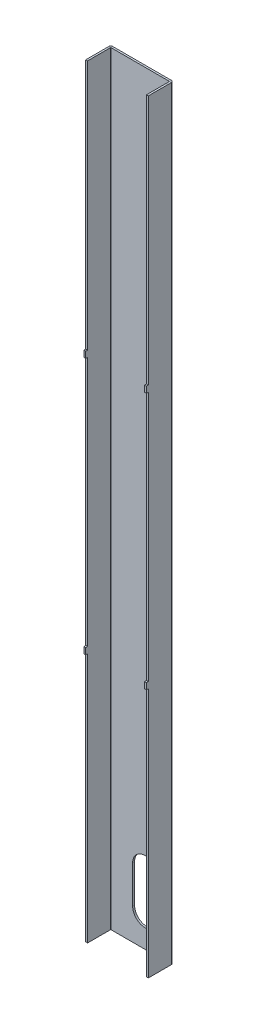
ISO-10303-21;
HEADER;
FILE_DESCRIPTION(('STEP AP214'),'2;1');
FILE_NAME('part.step','',(''),(''),'','','');
FILE_SCHEMA(('AUTOMOTIVE_DESIGN { 1 0 10303 214 1 1 1 1 }'));
ENDSEC;
DATA;
#1=APPLICATION_CONTEXT('core data for automotive mechanical design processes');
#2=APPLICATION_PROTOCOL_DEFINITION('international standard','automotive_design',2000,#1);
#3=PRODUCT_CONTEXT('',#1,'mechanical');
#4=PRODUCT('Part','Part','',(#3));
#5=PRODUCT_RELATED_PRODUCT_CATEGORY('part','',(#4));
#6=PRODUCT_DEFINITION_FORMATION('','',#4);
#7=PRODUCT_DEFINITION_CONTEXT('part definition',#1,'design');
#8=PRODUCT_DEFINITION('design','',#6,#7);
#9=PRODUCT_DEFINITION_SHAPE('','',#8);
#10=(LENGTH_UNIT() NAMED_UNIT(*) SI_UNIT(.MILLI.,.METRE.));
#11=(NAMED_UNIT(*) PLANE_ANGLE_UNIT() SI_UNIT($,.RADIAN.));
#12=(NAMED_UNIT(*) SI_UNIT($,.STERADIAN.) SOLID_ANGLE_UNIT());
#13=UNCERTAINTY_MEASURE_WITH_UNIT(LENGTH_MEASURE(1.E-05),#10,'distance_accuracy_value','');
#14=(GEOMETRIC_REPRESENTATION_CONTEXT(3) GLOBAL_UNCERTAINTY_ASSIGNED_CONTEXT((#13)) GLOBAL_UNIT_ASSIGNED_CONTEXT((#10,
#11,#12)) REPRESENTATION_CONTEXT('',''));
#15=CARTESIAN_POINT('',(0.,0.,0.));
#16=DIRECTION('',(0.,0.,1.));
#17=DIRECTION('',(1.,0.,0.));
#18=AXIS2_PLACEMENT_3D('',#15,#16,#17);
#19=CARTESIAN_POINT('',(1457.39849281617,-85.1666666666659,48.5000000000002));
#20=DIRECTION('',(0.,1.,0.));
#21=DIRECTION('',(1.,0.,0.));
#22=AXIS2_PLACEMENT_3D('',#19,#20,#21);
#23=PLANE('',#22);
#24=DIRECTION('',(0.,0.,-1.));
#25=VECTOR('',#24,1.);
#26=CARTESIAN_POINT('',(235.75,-85.1666666666659,48.5000000000002));
#27=LINE('',#26,#25);
#28=CARTESIAN_POINT('',(235.750000000001,-85.1666666666659,50.0000000000003));
#29=VERTEX_POINT('',#28);
#30=CARTESIAN_POINT('',(235.750000000001,-85.1666666666659,48.5000000000002));
#31=VERTEX_POINT('',#30);
#32=EDGE_CURVE('E161',#29,#31,#27,.T.);
#33=ORIENTED_EDGE('',*,*,#32,.F.);
#34=DIRECTION('',(-1.,0.,0.));
#35=VECTOR('',#34,1.);
#36=CARTESIAN_POINT('',(1457.39849281617,-85.1666666666659,50.0000000000003));
#37=LINE('',#36,#35);
#38=CARTESIAN_POINT('',(237.250000000001,-85.1666666666659,50.0000000000003));
#39=VERTEX_POINT('',#38);
#40=EDGE_CURVE('E438',#39,#29,#37,.T.);
#41=ORIENTED_EDGE('',*,*,#40,.F.);
#42=DIRECTION('',(0.,0.,-1.));
#43=VECTOR('',#42,1.);
#44=CARTESIAN_POINT('',(237.25,-85.1666666666659,48.5000000000002));
#45=LINE('',#44,#43);
#46=CARTESIAN_POINT('',(237.250000000001,-85.1666666666659,48.5000000000002));
#47=VERTEX_POINT('',#46);
#48=EDGE_CURVE('E155',#39,#47,#45,.T.);
#49=ORIENTED_EDGE('',*,*,#48,.T.);
#50=DIRECTION('',(-1.,0.,0.));
#51=VECTOR('',#50,1.);
#52=CARTESIAN_POINT('',(1457.39849281617,-85.1666666666659,48.5000000000002));
#53=LINE('',#52,#51);
#54=EDGE_CURVE('E445',#47,#31,#53,.T.);
#55=ORIENTED_EDGE('',*,*,#54,.T.);
#56=EDGE_LOOP('',(#33,#41,#49,#55));
#57=FACE_BOUND('',#56,.T.);
#58=ADVANCED_FACE('F53',(#57),#23,.T.);
#59=CARTESIAN_POINT('',(1457.39849281617,-90.1666666666659,50.0000000000003));
#60=DIRECTION('',(0.,0.,1.));
#61=DIRECTION('',(1.,0.,0.));
#62=AXIS2_PLACEMENT_3D('',#59,#60,#61);
#63=PLANE('',#62);
#64=DIRECTION('',(0.,1.,0.));
#65=VECTOR('',#64,1.);
#66=CARTESIAN_POINT('',(235.75,-90.1666666666659,50.0000000000003));
#67=LINE('',#66,#65);
#68=CARTESIAN_POINT('',(235.750000000001,-90.1666666666659,50.0000000000003));
#69=VERTEX_POINT('',#68);
#70=EDGE_CURVE('E484',#69,#29,#67,.T.);
#71=ORIENTED_EDGE('',*,*,#70,.F.);
#72=DIRECTION('',(-1.,0.,0.));
#73=VECTOR('',#72,1.);
#74=CARTESIAN_POINT('',(1457.39849281617,-90.1666666666659,50.0000000000003));
#75=LINE('',#74,#73);
#76=CARTESIAN_POINT('',(237.250000000001,-90.1666666666659,50.0000000000003));
#77=VERTEX_POINT('',#76);
#78=EDGE_CURVE('E430',#77,#69,#75,.T.);
#79=ORIENTED_EDGE('',*,*,#78,.F.);
#80=DIRECTION('',(0.,1.,0.));
#81=VECTOR('',#80,1.);
#82=CARTESIAN_POINT('',(237.25,-90.1666666666659,50.0000000000003));
#83=LINE('',#82,#81);
#84=EDGE_CURVE('E441',#77,#39,#83,.T.);
#85=ORIENTED_EDGE('',*,*,#84,.T.);
#86=ORIENTED_EDGE('',*,*,#40,.T.);
#87=EDGE_LOOP('',(#71,#79,#85,#86));
#88=FACE_BOUND('',#87,.T.);
#89=ADVANCED_FACE('F831',(#88),#63,.T.);
#90=CARTESIAN_POINT('',(1457.39849281617,-90.1666666666659,48.5000000000002));
#91=DIRECTION('',(0.,-1.,0.));
#92=DIRECTION('',(-1.,0.,0.));
#93=AXIS2_PLACEMENT_3D('',#90,#91,#92);
#94=PLANE('',#93);
#95=DIRECTION('',(0.,0.,1.));
#96=VECTOR('',#95,1.);
#97=CARTESIAN_POINT('',(235.75,-90.1666666666659,48.5000000000002));
#98=LINE('',#97,#96);
#99=CARTESIAN_POINT('',(235.750000000001,-90.1666666666659,48.5000000000002));
#100=VERTEX_POINT('',#99);
#101=EDGE_CURVE('E633',#100,#69,#98,.T.);
#102=ORIENTED_EDGE('',*,*,#101,.F.);
#103=DIRECTION('',(-1.,0.,0.));
#104=VECTOR('',#103,1.);
#105=CARTESIAN_POINT('',(1457.39849281617,-90.1666666666659,48.5000000000002));
#106=LINE('',#105,#104);
#107=CARTESIAN_POINT('',(237.250000000001,-90.1666666666659,48.5000000000002));
#108=VERTEX_POINT('',#107);
#109=EDGE_CURVE('E426',#108,#100,#106,.T.);
#110=ORIENTED_EDGE('',*,*,#109,.F.);
#111=DIRECTION('',(0.,0.,1.));
#112=VECTOR('',#111,1.);
#113=CARTESIAN_POINT('',(237.25,-90.1666666666659,48.5000000000002));
#114=LINE('',#113,#112);
#115=EDGE_CURVE('E434',#108,#77,#114,.T.);
#116=ORIENTED_EDGE('',*,*,#115,.T.);
#117=ORIENTED_EDGE('',*,*,#78,.T.);
#118=EDGE_LOOP('',(#102,#110,#116,#117));
#119=FACE_BOUND('',#118,.T.);
#120=ADVANCED_FACE('F836',(#119),#94,.T.);
#121=CARTESIAN_POINT('',(1457.39849281617,78.8516480713452,48.5000000000002));
#122=DIRECTION('',(0.,0.,1.));
#123=DIRECTION('',(1.,0.,0.));
#124=AXIS2_PLACEMENT_3D('',#121,#122,#123);
#125=PLANE('',#124);
#126=DIRECTION('',(0.,1.,0.));
#127=VECTOR('',#126,1.);
#128=CARTESIAN_POINT('',(235.75,78.8516480713452,48.5000000000002));
#129=LINE('',#128,#127);
#130=CARTESIAN_POINT('',(235.750000000001,-290.333333333333,48.5000000000002));
#131=VERTEX_POINT('',#130);
#132=EDGE_CURVE('E433',#100,#131,#129,.F.);
#133=ORIENTED_EDGE('',*,*,#132,.T.);
#134=DIRECTION('',(-1.,0.,0.));
#135=VECTOR('',#134,1.);
#136=CARTESIAN_POINT('',(1457.39849281617,-290.333333333333,48.5000000000002));
#137=LINE('',#136,#135);
#138=CARTESIAN_POINT('',(237.250000000001,-290.333333333333,48.5000000000002));
#139=VERTEX_POINT('',#138);
#140=EDGE_CURVE('E425',#139,#131,#137,.T.);
#141=ORIENTED_EDGE('',*,*,#140,.F.);
#142=DIRECTION('',(0.,1.,0.));
#143=VECTOR('',#142,1.);
#144=CARTESIAN_POINT('',(237.25,78.8516480713452,48.5000000000002));
#145=LINE('',#144,#143);
#146=EDGE_CURVE('E403',#139,#108,#145,.T.);
#147=ORIENTED_EDGE('',*,*,#146,.T.);
#148=ORIENTED_EDGE('',*,*,#109,.T.);
#149=EDGE_LOOP('',(#133,#141,#147,#148));
#150=FACE_BOUND('',#149,.T.);
#151=ADVANCED_FACE('F843',(#150),#125,.T.);
#152=CARTESIAN_POINT('',(1457.39849281617,-290.333333333333,48.5000000000002));
#153=DIRECTION('',(0.,1.,0.));
#154=DIRECTION('',(1.,0.,0.));
#155=AXIS2_PLACEMENT_3D('',#152,#153,#154);
#156=PLANE('',#155);
#157=DIRECTION('',(0.,0.,-1.));
#158=VECTOR('',#157,1.);
#159=CARTESIAN_POINT('',(235.75,-290.333333333333,48.5000000000002));
#160=LINE('',#159,#158);
#161=CARTESIAN_POINT('',(235.750000000001,-290.333333333333,50.0000000000003));
#162=VERTEX_POINT('',#161);
#163=EDGE_CURVE('E636',#162,#131,#160,.T.);
#164=ORIENTED_EDGE('',*,*,#163,.F.);
#165=DIRECTION('',(-1.,0.,0.));
#166=VECTOR('',#165,1.);
#167=CARTESIAN_POINT('',(1457.39849281617,-290.333333333333,50.0000000000003));
#168=LINE('',#167,#166);
#169=CARTESIAN_POINT('',(237.250000000001,-290.333333333333,50.0000000000003));
#170=VERTEX_POINT('',#169);
#171=EDGE_CURVE('E672',#170,#162,#168,.T.);
#172=ORIENTED_EDGE('',*,*,#171,.F.);
#173=DIRECTION('',(0.,0.,-1.));
#174=VECTOR('',#173,1.);
#175=CARTESIAN_POINT('',(237.25,-290.333333333333,48.5000000000002));
#176=LINE('',#175,#174);
#177=EDGE_CURVE('E420',#170,#139,#176,.T.);
#178=ORIENTED_EDGE('',*,*,#177,.T.);
#179=ORIENTED_EDGE('',*,*,#140,.T.);
#180=EDGE_LOOP('',(#164,#172,#178,#179));
#181=FACE_BOUND('',#180,.T.);
#182=ADVANCED_FACE('F848',(#181),#156,.T.);
#183=CARTESIAN_POINT('',(1457.39849281617,-295.333333333333,50.0000000000003));
#184=DIRECTION('',(0.,0.,1.));
#185=DIRECTION('',(1.,0.,0.));
#186=AXIS2_PLACEMENT_3D('',#183,#184,#185);
#187=PLANE('',#186);
#188=DIRECTION('',(0.,1.,0.));
#189=VECTOR('',#188,1.);
#190=CARTESIAN_POINT('',(235.75,-295.333333333333,50.0000000000003));
#191=LINE('',#190,#189);
#192=CARTESIAN_POINT('',(235.750000000001,-295.333333333333,50.0000000000003));
#193=VERTEX_POINT('',#192);
#194=EDGE_CURVE('E639',#193,#162,#191,.T.);
#195=ORIENTED_EDGE('',*,*,#194,.F.);
#196=DIRECTION('',(-1.,0.,0.));
#197=VECTOR('',#196,1.);
#198=CARTESIAN_POINT('',(1457.39849281617,-295.333333333333,50.0000000000003));
#199=LINE('',#198,#197);
#200=CARTESIAN_POINT('',(237.250000000001,-295.333333333333,50.0000000000003));
#201=VERTEX_POINT('',#200);
#202=EDGE_CURVE('E660',#201,#193,#199,.T.);
#203=ORIENTED_EDGE('',*,*,#202,.F.);
#204=DIRECTION('',(0.,1.,0.));
#205=VECTOR('',#204,1.);
#206=CARTESIAN_POINT('',(237.25,-295.333333333333,50.0000000000003));
#207=LINE('',#206,#205);
#208=EDGE_CURVE('E869',#201,#170,#207,.T.);
#209=ORIENTED_EDGE('',*,*,#208,.T.);
#210=ORIENTED_EDGE('',*,*,#171,.T.);
#211=EDGE_LOOP('',(#195,#203,#209,#210));
#212=FACE_BOUND('',#211,.T.);
#213=ADVANCED_FACE('F851',(#212),#187,.T.);
#214=CARTESIAN_POINT('',(1457.39849281617,-295.333333333333,48.5000000000002));
#215=DIRECTION('',(0.,-1.,0.));
#216=DIRECTION('',(-1.,0.,0.));
#217=AXIS2_PLACEMENT_3D('',#214,#215,#216);
#218=PLANE('',#217);
#219=DIRECTION('',(0.,0.,1.));
#220=VECTOR('',#219,1.);
#221=CARTESIAN_POINT('',(235.75,-295.333333333333,48.5000000000002));
#222=LINE('',#221,#220);
#223=CARTESIAN_POINT('',(235.750000000001,-295.333333333333,48.5000000000002));
#224=VERTEX_POINT('',#223);
#225=EDGE_CURVE('E364',#224,#193,#222,.T.);
#226=ORIENTED_EDGE('',*,*,#225,.F.);
#227=DIRECTION('',(-1.,0.,0.));
#228=VECTOR('',#227,1.);
#229=CARTESIAN_POINT('',(1457.39849281617,-295.333333333333,48.5000000000002));
#230=LINE('',#229,#228);
#231=CARTESIAN_POINT('',(237.250000000001,-295.333333333333,48.5000000000002));
#232=VERTEX_POINT('',#231);
#233=EDGE_CURVE('E657',#232,#224,#230,.T.);
#234=ORIENTED_EDGE('',*,*,#233,.F.);
#235=DIRECTION('',(0.,0.,1.));
#236=VECTOR('',#235,1.);
#237=CARTESIAN_POINT('',(237.25,-295.333333333333,48.5000000000002));
#238=LINE('',#237,#236);
#239=EDGE_CURVE('E668',#232,#201,#238,.T.);
#240=ORIENTED_EDGE('',*,*,#239,.T.);
#241=ORIENTED_EDGE('',*,*,#202,.T.);
#242=EDGE_LOOP('',(#226,#234,#240,#241));
#243=FACE_BOUND('',#242,.T.);
#244=ADVANCED_FACE('F656',(#243),#218,.T.);
#245=CARTESIAN_POINT('',(235.75,-495.5,48.5000000000002));
#246=VERTEX_POINT('',#245);
#247=EDGE_CURVE('E651',#224,#246,#129,.F.);
#248=ORIENTED_EDGE('',*,*,#247,.T.);
#249=DIRECTION('',(-1.,0.,0.));
#250=VECTOR('',#249,1.);
#251=CARTESIAN_POINT('',(1457.39849281617,-495.5,48.5000000000002));
#252=LINE('',#251,#250);
#253=CARTESIAN_POINT('',(237.250000000001,-495.5,48.5000000000002));
#254=VERTEX_POINT('',#253);
#255=EDGE_CURVE('E76',#254,#246,#252,.T.);
#256=ORIENTED_EDGE('',*,*,#255,.F.);
#257=EDGE_CURVE('E402',#254,#232,#145,.T.);
#258=ORIENTED_EDGE('',*,*,#257,.T.);
#259=ORIENTED_EDGE('',*,*,#233,.T.);
#260=EDGE_LOOP('',(#248,#256,#258,#259));
#261=FACE_BOUND('',#260,.T.);
#262=ADVANCED_FACE('F662',(#261),#125,.T.);
#263=CARTESIAN_POINT('',(235.750000000001,115.000000000002,48.5000000000002));
#264=VERTEX_POINT('',#263);
#265=EDGE_CURVE('E390',#264,#31,#129,.F.);
#266=ORIENTED_EDGE('',*,*,#265,.T.);
#267=ORIENTED_EDGE('',*,*,#54,.F.);
#268=CARTESIAN_POINT('',(237.250000000001,115.000000000002,48.5000000000002));
#269=VERTEX_POINT('',#268);
#270=EDGE_CURVE('E398',#47,#269,#145,.T.);
#271=ORIENTED_EDGE('',*,*,#270,.T.);
#272=DIRECTION('',(-1.,0.,0.));
#273=VECTOR('',#272,1.);
#274=CARTESIAN_POINT('',(1457.39849281617,115.000000000002,48.5000000000002));
#275=LINE('',#274,#273);
#276=EDGE_CURVE('E386',#269,#264,#275,.T.);
#277=ORIENTED_EDGE('',*,*,#276,.T.);
#278=EDGE_LOOP('',(#266,#267,#271,#277));
#279=FACE_BOUND('',#278,.T.);
#280=ADVANCED_FACE('F847',(#279),#125,.T.);
#281=CARTESIAN_POINT('',(1457.39849281617,115.,28.4999999999999));
#282=DIRECTION('',(0.,-1.,0.));
#283=DIRECTION('',(0.,0.,-1.));
#284=AXIS2_PLACEMENT_3D('',#281,#282,#283);
#285=PLANE('',#284);
#286=DIRECTION('',(-1.,0.,0.));
#287=VECTOR('',#286,1.);
#288=CARTESIAN_POINT('',(1457.39849281617,115.,30.1000000000002));
#289=LINE('',#288,#287);
#290=CARTESIAN_POINT('',(237.25,115.,30.1000000000002));
#291=VERTEX_POINT('',#290);
#292=CARTESIAN_POINT('',(235.75,115.,30.1000000000003));
#293=VERTEX_POINT('',#292);
#294=EDGE_CURVE('E372',#291,#293,#289,.T.);
#295=ORIENTED_EDGE('',*,*,#294,.T.);
#296=DIRECTION('',(0.,0.,-1.));
#297=VECTOR('',#296,1.);
#298=CARTESIAN_POINT('',(235.75,115.000000000002,48.5000000000002));
#299=LINE('',#298,#297);
#300=EDGE_CURVE('E365',#293,#264,#299,.F.);
#301=ORIENTED_EDGE('',*,*,#300,.T.);
#302=ORIENTED_EDGE('',*,*,#276,.F.);
#303=DIRECTION('',(0.,0.,-1.));
#304=VECTOR('',#303,1.);
#305=CARTESIAN_POINT('',(237.25,115.,28.4999999999999));
#306=LINE('',#305,#304);
#307=EDGE_CURVE('E12',#291,#269,#306,.F.);
#308=ORIENTED_EDGE('',*,*,#307,.F.);
#309=EDGE_LOOP('',(#295,#301,#302,#308));
#310=FACE_BOUND('',#309,.T.);
#311=ADVANCED_FACE('F381',(#310),#285,.F.);
#312=CARTESIAN_POINT('',(235.75,78.8516480713452,48.5000000000002));
#313=DIRECTION('',(1.,0.,0.));
#314=DIRECTION('',(0.,0.,-1.));
#315=AXIS2_PLACEMENT_3D('',#312,#313,#314);
#316=PLANE('',#315);
#317=ORIENTED_EDGE('',*,*,#300,.F.);
#318=DIRECTION('',(0.,-1.,0.));
#319=VECTOR('',#318,1.);
#320=CARTESIAN_POINT('',(235.75,115.000000000002,30.1000000000002));
#321=LINE('',#320,#319);
#322=CARTESIAN_POINT('',(235.75,-495.5,30.1000000000002));
#323=VERTEX_POINT('',#322);
#324=EDGE_CURVE('E352',#293,#323,#321,.T.);
#325=ORIENTED_EDGE('',*,*,#324,.T.);
#326=DIRECTION('',(0.,0.,-1.));
#327=VECTOR('',#326,1.);
#328=CARTESIAN_POINT('',(235.75,-495.5,0.));
#329=LINE('',#328,#327);
#330=EDGE_CURVE('E475',#246,#323,#329,.T.);
#331=ORIENTED_EDGE('',*,*,#330,.F.);
#332=ORIENTED_EDGE('',*,*,#247,.F.);
#333=ORIENTED_EDGE('',*,*,#225,.T.);
#334=ORIENTED_EDGE('',*,*,#194,.T.);
#335=ORIENTED_EDGE('',*,*,#163,.T.);
#336=ORIENTED_EDGE('',*,*,#132,.F.);
#337=ORIENTED_EDGE('',*,*,#101,.T.);
#338=ORIENTED_EDGE('',*,*,#70,.T.);
#339=ORIENTED_EDGE('',*,*,#32,.T.);
#340=ORIENTED_EDGE('',*,*,#265,.F.);
#341=EDGE_LOOP('',(#317,#325,#331,#332,#333,#334,#335,#336,#337,#338,#339,#340));
#342=FACE_BOUND('',#341,.T.);
#343=ADVANCED_FACE('F389',(#342),#316,.F.);
#344=CARTESIAN_POINT('',(1457.39849281617,-495.5,0.));
#345=DIRECTION('',(0.,-1.,0.));
#346=DIRECTION('',(-1.,0.,0.));
#347=AXIS2_PLACEMENT_3D('',#344,#345,#346);
#348=PLANE('',#347);
#349=ORIENTED_EDGE('',*,*,#330,.T.);
#350=DIRECTION('',(-1.,0.,0.));
#351=VECTOR('',#350,1.);
#352=CARTESIAN_POINT('',(1457.39849281617,-495.5,30.1000000000002));
#353=LINE('',#352,#351);
#354=CARTESIAN_POINT('',(237.25,-495.5,30.1000000000002));
#355=VERTEX_POINT('',#354);
#356=EDGE_CURVE('E57',#355,#323,#353,.T.);
#357=ORIENTED_EDGE('',*,*,#356,.F.);
#358=DIRECTION('',(0.,0.,-1.));
#359=VECTOR('',#358,1.);
#360=CARTESIAN_POINT('',(237.25,-495.5,0.));
#361=LINE('',#360,#359);
#362=EDGE_CURVE('E618',#254,#355,#361,.T.);
#363=ORIENTED_EDGE('',*,*,#362,.F.);
#364=ORIENTED_EDGE('',*,*,#255,.T.);
#365=EDGE_LOOP('',(#349,#357,#363,#364));
#366=FACE_BOUND('',#365,.T.);
#367=ADVANCED_FACE('F861',(#366),#348,.T.);
#368=CARTESIAN_POINT('',(237.25,78.8516480713452,48.5000000000002));
#369=DIRECTION('',(-1.,0.,0.));
#370=DIRECTION('',(0.,0.,1.));
#371=AXIS2_PLACEMENT_3D('',#368,#369,#370);
#372=PLANE('',#371);
#373=ORIENTED_EDGE('',*,*,#362,.T.);
#374=DIRECTION('',(0.,1.,0.));
#375=VECTOR('',#374,1.);
#376=CARTESIAN_POINT('',(237.25,115.000000000002,30.1000000000002));
#377=LINE('',#376,#375);
#378=EDGE_CURVE('E64',#355,#291,#377,.T.);
#379=ORIENTED_EDGE('',*,*,#378,.T.);
#380=ORIENTED_EDGE('',*,*,#307,.T.);
#381=ORIENTED_EDGE('',*,*,#270,.F.);
#382=ORIENTED_EDGE('',*,*,#48,.F.);
#383=ORIENTED_EDGE('',*,*,#84,.F.);
#384=ORIENTED_EDGE('',*,*,#115,.F.);
#385=ORIENTED_EDGE('',*,*,#146,.F.);
#386=ORIENTED_EDGE('',*,*,#177,.F.);
#387=ORIENTED_EDGE('',*,*,#208,.F.);
#388=ORIENTED_EDGE('',*,*,#239,.F.);
#389=ORIENTED_EDGE('',*,*,#257,.F.);
#390=EDGE_LOOP('',(#373,#379,#380,#381,#382,#383,#384,#385,#386,#387,#388,#389));
#391=FACE_BOUND('',#390,.T.);
#392=ADVANCED_FACE('F55',(#391),#372,.F.);
#393=CARTESIAN_POINT('',(-935.898492816167,-295.333333333332,48.5));
#394=DIRECTION('',(0.,-1.,0.));
#395=DIRECTION('',(1.,0.,0.));
#396=AXIS2_PLACEMENT_3D('',#393,#394,#395);
#397=PLANE('',#396);
#398=DIRECTION('',(0.,0.,-1.));
#399=VECTOR('',#398,1.);
#400=CARTESIAN_POINT('',(285.75,-295.333333333332,48.5));
#401=LINE('',#400,#399);
#402=CARTESIAN_POINT('',(285.75,-295.333333333332,50.0000000000002));
#403=VERTEX_POINT('',#402);
#404=CARTESIAN_POINT('',(285.75,-295.333333333332,48.5));
#405=VERTEX_POINT('',#404);
#406=EDGE_CURVE('E501',#403,#405,#401,.T.);
#407=ORIENTED_EDGE('',*,*,#406,.F.);
#408=DIRECTION('',(1.,0.,0.));
#409=VECTOR('',#408,1.);
#410=CARTESIAN_POINT('',(-935.898492816167,-295.333333333332,50.0000000000002));
#411=LINE('',#410,#409);
#412=CARTESIAN_POINT('',(284.25,-295.333333333332,50.0000000000002));
#413=VERTEX_POINT('',#412);
#414=EDGE_CURVE('E721',#413,#403,#411,.T.);
#415=ORIENTED_EDGE('',*,*,#414,.F.);
#416=DIRECTION('',(0.,0.,-1.));
#417=VECTOR('',#416,1.);
#418=CARTESIAN_POINT('',(284.25,-295.333333333332,48.5));
#419=LINE('',#418,#417);
#420=CARTESIAN_POINT('',(284.25,-295.333333333332,48.5));
#421=VERTEX_POINT('',#420);
#422=EDGE_CURVE('E790',#413,#421,#419,.T.);
#423=ORIENTED_EDGE('',*,*,#422,.T.);
#424=DIRECTION('',(1.,0.,0.));
#425=VECTOR('',#424,1.);
#426=CARTESIAN_POINT('',(-935.898492816167,-295.333333333332,48.5));
#427=LINE('',#426,#425);
#428=EDGE_CURVE('E1378',#421,#405,#427,.T.);
#429=ORIENTED_EDGE('',*,*,#428,.T.);
#430=EDGE_LOOP('',(#407,#415,#423,#429));
#431=FACE_BOUND('',#430,.T.);
#432=ADVANCED_FACE('F866',(#431),#397,.T.);
#433=CARTESIAN_POINT('',(-935.898492816167,-290.333333333332,50.0000000000002));
#434=DIRECTION('',(0.,0.,1.));
#435=DIRECTION('',(1.,0.,0.));
#436=AXIS2_PLACEMENT_3D('',#433,#434,#435);
#437=PLANE('',#436);
#438=DIRECTION('',(0.,-1.,0.));
#439=VECTOR('',#438,1.);
#440=CARTESIAN_POINT('',(285.75,-290.333333333332,50.0000000000002));
#441=LINE('',#440,#439);
#442=CARTESIAN_POINT('',(285.75,-290.333333333332,50.0000000000002));
#443=VERTEX_POINT('',#442);
#444=EDGE_CURVE('E505',#443,#403,#441,.T.);
#445=ORIENTED_EDGE('',*,*,#444,.F.);
#446=DIRECTION('',(1.,0.,0.));
#447=VECTOR('',#446,1.);
#448=CARTESIAN_POINT('',(-935.898492816167,-290.333333333332,50.0000000000002));
#449=LINE('',#448,#447);
#450=CARTESIAN_POINT('',(284.25,-290.333333333332,50.0000000000002));
#451=VERTEX_POINT('',#450);
#452=EDGE_CURVE('E710',#451,#443,#449,.T.);
#453=ORIENTED_EDGE('',*,*,#452,.F.);
#454=DIRECTION('',(0.,-1.,0.));
#455=VECTOR('',#454,1.);
#456=CARTESIAN_POINT('',(284.25,-290.333333333332,50.0000000000002));
#457=LINE('',#456,#455);
#458=EDGE_CURVE('E1368',#451,#413,#457,.T.);
#459=ORIENTED_EDGE('',*,*,#458,.T.);
#460=ORIENTED_EDGE('',*,*,#414,.T.);
#461=EDGE_LOOP('',(#445,#453,#459,#460));
#462=FACE_BOUND('',#461,.T.);
#463=ADVANCED_FACE('F956',(#462),#437,.T.);
#464=CARTESIAN_POINT('',(-935.898492816167,-290.333333333332,48.5));
#465=DIRECTION('',(0.,1.,0.));
#466=DIRECTION('',(-1.,0.,0.));
#467=AXIS2_PLACEMENT_3D('',#464,#465,#466);
#468=PLANE('',#467);
#469=DIRECTION('',(0.,0.,1.));
#470=VECTOR('',#469,1.);
#471=CARTESIAN_POINT('',(285.75,-290.333333333332,48.5));
#472=LINE('',#471,#470);
#473=CARTESIAN_POINT('',(285.75,-290.333333333332,48.5));
#474=VERTEX_POINT('',#473);
#475=EDGE_CURVE('E528',#474,#443,#472,.T.);
#476=ORIENTED_EDGE('',*,*,#475,.F.);
#477=DIRECTION('',(1.,0.,0.));
#478=VECTOR('',#477,1.);
#479=CARTESIAN_POINT('',(-935.898492816167,-290.333333333332,48.5));
#480=LINE('',#479,#478);
#481=CARTESIAN_POINT('',(284.25,-290.333333333332,48.5));
#482=VERTEX_POINT('',#481);
#483=EDGE_CURVE('E700',#482,#474,#480,.T.);
#484=ORIENTED_EDGE('',*,*,#483,.F.);
#485=DIRECTION('',(0.,0.,1.));
#486=VECTOR('',#485,1.);
#487=CARTESIAN_POINT('',(284.25,-290.333333333332,48.5));
#488=LINE('',#487,#486);
#489=EDGE_CURVE('E714',#482,#451,#488,.T.);
#490=ORIENTED_EDGE('',*,*,#489,.T.);
#491=ORIENTED_EDGE('',*,*,#452,.T.);
#492=EDGE_LOOP('',(#476,#484,#490,#491));
#493=FACE_BOUND('',#492,.T.);
#494=ADVANCED_FACE('F966',(#493),#468,.T.);
#495=CARTESIAN_POINT('',(-935.898492816167,78.8516480713452,48.5));
#496=DIRECTION('',(0.,0.,1.));
#497=DIRECTION('',(1.,0.,0.));
#498=AXIS2_PLACEMENT_3D('',#495,#496,#497);
#499=PLANE('',#498);
#500=DIRECTION('',(0.,1.,0.));
#501=VECTOR('',#500,1.);
#502=CARTESIAN_POINT('',(285.75,78.8516480713452,48.5));
#503=LINE('',#502,#501);
#504=CARTESIAN_POINT('',(285.75,-90.1666666666649,48.5));
#505=VERTEX_POINT('',#504);
#506=EDGE_CURVE('E518',#474,#505,#503,.T.);
#507=ORIENTED_EDGE('',*,*,#506,.T.);
#508=DIRECTION('',(1.,0.,0.));
#509=VECTOR('',#508,1.);
#510=CARTESIAN_POINT('',(-935.898492816167,-90.1666666666649,48.5));
#511=LINE('',#510,#509);
#512=CARTESIAN_POINT('',(284.25,-90.1666666666649,48.5));
#513=VERTEX_POINT('',#512);
#514=EDGE_CURVE('E736',#513,#505,#511,.T.);
#515=ORIENTED_EDGE('',*,*,#514,.F.);
#516=DIRECTION('',(0.,1.,0.));
#517=VECTOR('',#516,1.);
#518=CARTESIAN_POINT('',(284.25,78.8516480713452,48.5));
#519=LINE('',#518,#517);
#520=EDGE_CURVE('E694',#513,#482,#519,.F.);
#521=ORIENTED_EDGE('',*,*,#520,.T.);
#522=ORIENTED_EDGE('',*,*,#483,.T.);
#523=EDGE_LOOP('',(#507,#515,#521,#522));
#524=FACE_BOUND('',#523,.T.);
#525=ADVANCED_FACE('F976',(#524),#499,.T.);
#526=CARTESIAN_POINT('',(-935.898492816167,-90.1666666666649,48.5));
#527=DIRECTION('',(0.,-1.,0.));
#528=DIRECTION('',(1.,0.,0.));
#529=AXIS2_PLACEMENT_3D('',#526,#527,#528);
#530=PLANE('',#529);
#531=DIRECTION('',(0.,0.,-1.));
#532=VECTOR('',#531,1.);
#533=CARTESIAN_POINT('',(285.75,-90.1666666666649,48.5));
#534=LINE('',#533,#532);
#535=CARTESIAN_POINT('',(285.75,-90.1666666666649,50.0000000000002));
#536=VERTEX_POINT('',#535);
#537=EDGE_CURVE('E531',#536,#505,#534,.T.);
#538=ORIENTED_EDGE('',*,*,#537,.F.);
#539=DIRECTION('',(1.,0.,0.));
#540=VECTOR('',#539,1.);
#541=CARTESIAN_POINT('',(-935.898492816167,-90.1666666666649,50.0000000000002));
#542=LINE('',#541,#540);
#543=CARTESIAN_POINT('',(284.25,-90.1666666666649,50.0000000000002));
#544=VERTEX_POINT('',#543);
#545=EDGE_CURVE('E743',#544,#536,#542,.T.);
#546=ORIENTED_EDGE('',*,*,#545,.F.);
#547=DIRECTION('',(0.,0.,-1.));
#548=VECTOR('',#547,1.);
#549=CARTESIAN_POINT('',(284.25,-90.1666666666649,48.5));
#550=LINE('',#549,#548);
#551=EDGE_CURVE('E707',#544,#513,#550,.T.);
#552=ORIENTED_EDGE('',*,*,#551,.T.);
#553=ORIENTED_EDGE('',*,*,#514,.T.);
#554=EDGE_LOOP('',(#538,#546,#552,#553));
#555=FACE_BOUND('',#554,.T.);
#556=ADVANCED_FACE('F985',(#555),#530,.T.);
#557=CARTESIAN_POINT('',(-935.898492816167,-85.1666666666649,50.0000000000002));
#558=DIRECTION('',(0.,0.,1.));
#559=DIRECTION('',(1.,0.,0.));
#560=AXIS2_PLACEMENT_3D('',#557,#558,#559);
#561=PLANE('',#560);
#562=DIRECTION('',(0.,-1.,0.));
#563=VECTOR('',#562,1.);
#564=CARTESIAN_POINT('',(285.75,-85.1666666666649,50.0000000000002));
#565=LINE('',#564,#563);
#566=CARTESIAN_POINT('',(285.75,-85.1666666666649,50.0000000000002));
#567=VERTEX_POINT('',#566);
#568=EDGE_CURVE('E535',#567,#536,#565,.T.);
#569=ORIENTED_EDGE('',*,*,#568,.F.);
#570=DIRECTION('',(1.,0.,0.));
#571=VECTOR('',#570,1.);
#572=CARTESIAN_POINT('',(-935.898492816167,-85.1666666666649,50.0000000000002));
#573=LINE('',#572,#571);
#574=CARTESIAN_POINT('',(284.25,-85.1666666666649,50.0000000000002));
#575=VERTEX_POINT('',#574);
#576=EDGE_CURVE('E516',#575,#567,#573,.T.);
#577=ORIENTED_EDGE('',*,*,#576,.F.);
#578=DIRECTION('',(0.,-1.,0.));
#579=VECTOR('',#578,1.);
#580=CARTESIAN_POINT('',(284.25,-85.1666666666649,50.0000000000002));
#581=LINE('',#580,#579);
#582=EDGE_CURVE('E738',#575,#544,#581,.T.);
#583=ORIENTED_EDGE('',*,*,#582,.T.);
#584=ORIENTED_EDGE('',*,*,#545,.T.);
#585=EDGE_LOOP('',(#569,#577,#583,#584));
#586=FACE_BOUND('',#585,.T.);
#587=ADVANCED_FACE('F996',(#586),#561,.T.);
#588=CARTESIAN_POINT('',(-935.898492816167,-85.1666666666649,48.5));
#589=DIRECTION('',(0.,1.,0.));
#590=DIRECTION('',(-1.,0.,0.));
#591=AXIS2_PLACEMENT_3D('',#588,#589,#590);
#592=PLANE('',#591);
#593=DIRECTION('',(0.,0.,1.));
#594=VECTOR('',#593,1.);
#595=CARTESIAN_POINT('',(285.75,-85.1666666666649,48.5));
#596=LINE('',#595,#594);
#597=CARTESIAN_POINT('',(285.75,-85.1666666666649,48.5));
#598=VERTEX_POINT('',#597);
#599=EDGE_CURVE('E539',#598,#567,#596,.T.);
#600=ORIENTED_EDGE('',*,*,#599,.F.);
#601=DIRECTION('',(1.,0.,0.));
#602=VECTOR('',#601,1.);
#603=CARTESIAN_POINT('',(-935.898492816167,-85.1666666666649,48.5));
#604=LINE('',#603,#602);
#605=CARTESIAN_POINT('',(284.25,-85.1666666666649,48.5));
#606=VERTEX_POINT('',#605);
#607=EDGE_CURVE('E520',#606,#598,#604,.T.);
#608=ORIENTED_EDGE('',*,*,#607,.F.);
#609=DIRECTION('',(0.,0.,1.));
#610=VECTOR('',#609,1.);
#611=CARTESIAN_POINT('',(284.25,-85.1666666666649,48.5));
#612=LINE('',#611,#610);
#613=EDGE_CURVE('E747',#606,#575,#612,.T.);
#614=ORIENTED_EDGE('',*,*,#613,.T.);
#615=ORIENTED_EDGE('',*,*,#576,.T.);
#616=EDGE_LOOP('',(#600,#608,#614,#615));
#617=FACE_BOUND('',#616,.T.);
#618=ADVANCED_FACE('F1006',(#617),#592,.T.);
#619=CARTESIAN_POINT('',(285.75,115.000000000003,48.5));
#620=VERTEX_POINT('',#619);
#621=EDGE_CURVE('E257',#598,#620,#503,.T.);
#622=ORIENTED_EDGE('',*,*,#621,.T.);
#623=DIRECTION('',(1.,0.,0.));
#624=VECTOR('',#623,1.);
#625=CARTESIAN_POINT('',(-935.898492816167,115.000000000003,48.5));
#626=LINE('',#625,#624);
#627=CARTESIAN_POINT('',(284.25,115.000000000003,48.5));
#628=VERTEX_POINT('',#627);
#629=EDGE_CURVE('E497',#628,#620,#626,.T.);
#630=ORIENTED_EDGE('',*,*,#629,.F.);
#631=EDGE_CURVE('E174',#628,#606,#519,.F.);
#632=ORIENTED_EDGE('',*,*,#631,.T.);
#633=ORIENTED_EDGE('',*,*,#607,.T.);
#634=EDGE_LOOP('',(#622,#630,#632,#633));
#635=FACE_BOUND('',#634,.T.);
#636=ADVANCED_FACE('F987',(#635),#499,.T.);
#637=CARTESIAN_POINT('',(285.75,-495.5,48.5));
#638=VERTEX_POINT('',#637);
#639=EDGE_CURVE('E517',#638,#405,#503,.T.);
#640=ORIENTED_EDGE('',*,*,#639,.T.);
#641=ORIENTED_EDGE('',*,*,#428,.F.);
#642=CARTESIAN_POINT('',(284.25,-495.5,48.5));
#643=VERTEX_POINT('',#642);
#644=EDGE_CURVE('E687',#421,#643,#519,.F.);
#645=ORIENTED_EDGE('',*,*,#644,.T.);
#646=DIRECTION('',(1.,0.,0.));
#647=VECTOR('',#646,1.);
#648=CARTESIAN_POINT('',(-935.898492816167,-495.5,48.5));
#649=LINE('',#648,#647);
#650=EDGE_CURVE('E684',#643,#638,#649,.T.);
#651=ORIENTED_EDGE('',*,*,#650,.T.);
#652=EDGE_LOOP('',(#640,#641,#645,#651));
#653=FACE_BOUND('',#652,.T.);
#654=ADVANCED_FACE('F988',(#653),#499,.T.);
#655=CARTESIAN_POINT('',(-935.898492816167,-495.5,-1.66533453693773E-13));
#656=DIRECTION('',(0.,-1.,0.));
#657=DIRECTION('',(1.,0.,0.));
#658=AXIS2_PLACEMENT_3D('',#655,#656,#657);
#659=PLANE('',#658);
#660=DIRECTION('',(0.,0.,-1.));
#661=VECTOR('',#660,1.);
#662=CARTESIAN_POINT('',(285.75,-495.5,-1.11022302462516E-13));
#663=LINE('',#662,#661);
#664=CARTESIAN_POINT('',(285.75,-495.5,30.0999999999998));
#665=VERTEX_POINT('',#664);
#666=EDGE_CURVE('E682',#665,#638,#663,.F.);
#667=ORIENTED_EDGE('',*,*,#666,.T.);
#668=ORIENTED_EDGE('',*,*,#650,.F.);
#669=DIRECTION('',(0.,0.,-1.));
#670=VECTOR('',#669,1.);
#671=CARTESIAN_POINT('',(284.25,-495.5,-1.11022302462516E-13));
#672=LINE('',#671,#670);
#673=CARTESIAN_POINT('',(284.25,-495.5,30.1000000000001));
#674=VERTEX_POINT('',#673);
#675=EDGE_CURVE('E678',#643,#674,#672,.T.);
#676=ORIENTED_EDGE('',*,*,#675,.T.);
#677=DIRECTION('',(1.,0.,0.));
#678=VECTOR('',#677,1.);
#679=CARTESIAN_POINT('',(-935.898492816167,-495.5,30.1000000000001));
#680=LINE('',#679,#678);
#681=EDGE_CURVE('E547',#674,#665,#680,.T.);
#682=ORIENTED_EDGE('',*,*,#681,.T.);
#683=EDGE_LOOP('',(#667,#668,#676,#682));
#684=FACE_BOUND('',#683,.T.);
#685=ADVANCED_FACE('F1033',(#684),#659,.T.);
#686=CARTESIAN_POINT('',(285.75,78.8516480713452,28.5000000000001));
#687=DIRECTION('',(-1.,0.,0.));
#688=DIRECTION('',(0.,0.,1.));
#689=AXIS2_PLACEMENT_3D('',#686,#687,#688);
#690=PLANE('',#689);
#691=ORIENTED_EDGE('',*,*,#666,.F.);
#692=DIRECTION('',(0.,1.,0.));
#693=VECTOR('',#692,1.);
#694=CARTESIAN_POINT('',(285.75,-495.5,30.1000000000001));
#695=LINE('',#694,#693);
#696=CARTESIAN_POINT('',(285.75,115.,30.1000000000001));
#697=VERTEX_POINT('',#696);
#698=EDGE_CURVE('E543',#665,#697,#695,.T.);
#699=ORIENTED_EDGE('',*,*,#698,.T.);
#700=DIRECTION('',(0.,0.,-1.));
#701=VECTOR('',#700,1.);
#702=CARTESIAN_POINT('',(285.75,115.,28.4999999999997));
#703=LINE('',#702,#701);
#704=EDGE_CURVE('E262',#620,#697,#703,.T.);
#705=ORIENTED_EDGE('',*,*,#704,.F.);
#706=ORIENTED_EDGE('',*,*,#621,.F.);
#707=ORIENTED_EDGE('',*,*,#599,.T.);
#708=ORIENTED_EDGE('',*,*,#568,.T.);
#709=ORIENTED_EDGE('',*,*,#537,.T.);
#710=ORIENTED_EDGE('',*,*,#506,.F.);
#711=ORIENTED_EDGE('',*,*,#475,.T.);
#712=ORIENTED_EDGE('',*,*,#444,.T.);
#713=ORIENTED_EDGE('',*,*,#406,.T.);
#714=ORIENTED_EDGE('',*,*,#639,.F.);
#715=EDGE_LOOP('',(#691,#699,#705,#706,#707,#708,#709,#710,#711,#712,#713,#714));
#716=FACE_BOUND('',#715,.T.);
#717=ADVANCED_FACE('F1041',(#716),#690,.F.);
#718=CARTESIAN_POINT('',(-935.898492816167,115.,28.4999999999997));
#719=DIRECTION('',(0.,-1.,0.));
#720=DIRECTION('',(0.,0.,1.));
#721=AXIS2_PLACEMENT_3D('',#718,#719,#720);
#722=PLANE('',#721);
#723=ORIENTED_EDGE('',*,*,#629,.T.);
#724=ORIENTED_EDGE('',*,*,#704,.T.);
#725=DIRECTION('',(1.,0.,0.));
#726=VECTOR('',#725,1.);
#727=CARTESIAN_POINT('',(-935.898492816167,115.,30.1000000000001));
#728=LINE('',#727,#726);
#729=CARTESIAN_POINT('',(284.25,115.,30.1000000000001));
#730=VERTEX_POINT('',#729);
#731=EDGE_CURVE('E782',#730,#697,#728,.T.);
#732=ORIENTED_EDGE('',*,*,#731,.F.);
#733=DIRECTION('',(0.,0.,-1.));
#734=VECTOR('',#733,1.);
#735=CARTESIAN_POINT('',(284.25,115.,28.4999999999997));
#736=LINE('',#735,#734);
#737=EDGE_CURVE('E456',#628,#730,#736,.T.);
#738=ORIENTED_EDGE('',*,*,#737,.F.);
#739=EDGE_LOOP('',(#723,#724,#732,#738));
#740=FACE_BOUND('',#739,.T.);
#741=ADVANCED_FACE('F825',(#740),#722,.F.);
#742=CARTESIAN_POINT('',(284.25,78.8516480713452,30.0000000000001));
#743=DIRECTION('',(1.,0.,0.));
#744=DIRECTION('',(0.,0.,-1.));
#745=AXIS2_PLACEMENT_3D('',#742,#743,#744);
#746=PLANE('',#745);
#747=ORIENTED_EDGE('',*,*,#737,.T.);
#748=DIRECTION('',(0.,-1.,0.));
#749=VECTOR('',#748,1.);
#750=CARTESIAN_POINT('',(284.25,-495.5,30.1000000000001));
#751=LINE('',#750,#749);
#752=EDGE_CURVE('E450',#730,#674,#751,.T.);
#753=ORIENTED_EDGE('',*,*,#752,.T.);
#754=ORIENTED_EDGE('',*,*,#675,.F.);
#755=ORIENTED_EDGE('',*,*,#644,.F.);
#756=ORIENTED_EDGE('',*,*,#422,.F.);
#757=ORIENTED_EDGE('',*,*,#458,.F.);
#758=ORIENTED_EDGE('',*,*,#489,.F.);
#759=ORIENTED_EDGE('',*,*,#520,.F.);
#760=ORIENTED_EDGE('',*,*,#551,.F.);
#761=ORIENTED_EDGE('',*,*,#582,.F.);
#762=ORIENTED_EDGE('',*,*,#613,.F.);
#763=ORIENTED_EDGE('',*,*,#631,.F.);
#764=EDGE_LOOP('',(#747,#753,#754,#755,#756,#757,#758,#759,#760,#761,#762,#763));
#765=FACE_BOUND('',#764,.T.);
#766=ADVANCED_FACE('F815',(#765),#746,.F.);
#767=CARTESIAN_POINT('',(235.75,78.8516480713452,28.5000000000001));
#768=DIRECTION('',(0.,0.,1.));
#769=DIRECTION('',(1.,0.,0.));
#770=AXIS2_PLACEMENT_3D('',#767,#768,#769);
#771=PLANE('',#770);
#772=DIRECTION('',(0.,1.,0.));
#773=VECTOR('',#772,1.);
#774=CARTESIAN_POINT('',(254.75,78.8516480713452,28.5000000000001));
#775=LINE('',#774,#773);
#776=CARTESIAN_POINT('',(254.75,-470.5,28.5000000000001));
#777=VERTEX_POINT('',#776);
#778=CARTESIAN_POINT('',(254.75,-440.5,28.5000000000001));
#779=VERTEX_POINT('',#778);
#780=EDGE_CURVE('E753',#777,#779,#775,.T.);
#781=ORIENTED_EDGE('',*,*,#780,.F.);
#782=CARTESIAN_POINT('',(264.75,-470.5,28.5000000000001));
#783=DIRECTION('',(0.,0.,-1.));
#784=DIRECTION('',(-1.,0.,0.));
#785=AXIS2_PLACEMENT_3D('',#782,#783,#784);
#786=CIRCLE('',#785,10.);
#787=CARTESIAN_POINT('',(274.75,-470.5,28.5000000000001));
#788=VERTEX_POINT('',#787);
#789=EDGE_CURVE('E758',#788,#777,#786,.T.);
#790=ORIENTED_EDGE('',*,*,#789,.F.);
#791=DIRECTION('',(0.,1.,0.));
#792=VECTOR('',#791,1.);
#793=CARTESIAN_POINT('',(274.75,78.8516480713452,28.5000000000001));
#794=LINE('',#793,#792);
#795=CARTESIAN_POINT('',(274.75,-440.5,28.5000000000001));
#796=VERTEX_POINT('',#795);
#797=EDGE_CURVE('E1329',#796,#788,#794,.F.);
#798=ORIENTED_EDGE('',*,*,#797,.F.);
#799=CARTESIAN_POINT('',(264.75,-440.5,28.5000000000001));
#800=DIRECTION('',(0.,0.,-1.));
#801=DIRECTION('',(-1.,0.,0.));
#802=AXIS2_PLACEMENT_3D('',#799,#800,#801);
#803=CIRCLE('',#802,10.);
#804=EDGE_CURVE('E1339',#779,#796,#803,.T.);
#805=ORIENTED_EDGE('',*,*,#804,.F.);
#806=EDGE_LOOP('',(#781,#790,#798,#805));
#807=FACE_BOUND('',#806,.T.);
#808=DIRECTION('',(0.,-1.,0.));
#809=VECTOR('',#808,1.);
#810=CARTESIAN_POINT('',(237.35,115.000000000001,28.5000000000002));
#811=LINE('',#810,#809);
#812=CARTESIAN_POINT('',(237.35,115.000000000003,28.5000000000001));
#813=VERTEX_POINT('',#812);
#814=CARTESIAN_POINT('',(237.35,-495.5,28.5000000000001));
#815=VERTEX_POINT('',#814);
#816=EDGE_CURVE('E600',#813,#815,#811,.T.);
#817=ORIENTED_EDGE('',*,*,#816,.F.);
#818=DIRECTION('',(1.,0.,0.));
#819=VECTOR('',#818,1.);
#820=CARTESIAN_POINT('',(235.75,115.000000000003,28.5000000000001));
#821=LINE('',#820,#819);
#822=CARTESIAN_POINT('',(284.15,115.,28.5000000000002));
#823=VERTEX_POINT('',#822);
#824=EDGE_CURVE('E271',#823,#813,#821,.F.);
#825=ORIENTED_EDGE('',*,*,#824,.F.);
#826=DIRECTION('',(0.,1.,0.));
#827=VECTOR('',#826,1.);
#828=CARTESIAN_POINT('',(284.15,-495.5,28.5000000000002));
#829=LINE('',#828,#827);
#830=CARTESIAN_POINT('',(284.15,-495.5,28.5000000000001));
#831=VERTEX_POINT('',#830);
#832=EDGE_CURVE('E278',#831,#823,#829,.T.);
#833=ORIENTED_EDGE('',*,*,#832,.F.);
#834=DIRECTION('',(1.,0.,0.));
#835=VECTOR('',#834,1.);
#836=CARTESIAN_POINT('',(235.75,-495.5,28.5000000000001));
#837=LINE('',#836,#835);
#838=EDGE_CURVE('E590',#815,#831,#837,.T.);
#839=ORIENTED_EDGE('',*,*,#838,.F.);
#840=EDGE_LOOP('',(#817,#825,#833,#839));
#841=FACE_BOUND('',#840,.T.);
#842=ADVANCED_FACE('F812',(#807,#841),#771,.F.);
#843=CARTESIAN_POINT('',(237.25,78.8516480713452,30.0000000000002));
#844=DIRECTION('',(0.,0.,-1.));
#845=DIRECTION('',(-1.,0.,0.));
#846=AXIS2_PLACEMENT_3D('',#843,#844,#845);
#847=PLANE('',#846);
#848=DIRECTION('',(0.,1.,0.));
#849=VECTOR('',#848,1.);
#850=CARTESIAN_POINT('',(274.75,-470.5,30.0000000000002));
#851=LINE('',#850,#849);
#852=CARTESIAN_POINT('',(274.75,-440.5,30.0000000000002));
#853=VERTEX_POINT('',#852);
#854=CARTESIAN_POINT('',(274.75,-470.5,30.0000000000002));
#855=VERTEX_POINT('',#854);
#856=EDGE_CURVE('E567',#853,#855,#851,.F.);
#857=ORIENTED_EDGE('',*,*,#856,.T.);
#858=CARTESIAN_POINT('',(264.75,-470.5,30.0000000000002));
#859=DIRECTION('',(0.,0.,-1.));
#860=DIRECTION('',(-1.,0.,0.));
#861=AXIS2_PLACEMENT_3D('',#858,#859,#860);
#862=CIRCLE('',#861,10.);
#863=CARTESIAN_POINT('',(254.75,-470.5,30.0000000000002));
#864=VERTEX_POINT('',#863);
#865=EDGE_CURVE('E578',#855,#864,#862,.T.);
#866=ORIENTED_EDGE('',*,*,#865,.T.);
#867=DIRECTION('',(0.,1.,0.));
#868=VECTOR('',#867,1.);
#869=CARTESIAN_POINT('',(254.75,-470.5,30.0000000000002));
#870=LINE('',#869,#868);
#871=CARTESIAN_POINT('',(254.75,-440.5,30.0000000000002));
#872=VERTEX_POINT('',#871);
#873=EDGE_CURVE('E582',#864,#872,#870,.T.);
#874=ORIENTED_EDGE('',*,*,#873,.T.);
#875=CARTESIAN_POINT('',(264.75,-440.5,30.0000000000002));
#876=DIRECTION('',(0.,0.,-1.));
#877=DIRECTION('',(-1.,0.,0.));
#878=AXIS2_PLACEMENT_3D('',#875,#876,#877);
#879=CIRCLE('',#878,10.);
#880=EDGE_CURVE('E1318',#872,#853,#879,.T.);
#881=ORIENTED_EDGE('',*,*,#880,.T.);
#882=EDGE_LOOP('',(#857,#866,#874,#881));
#883=FACE_BOUND('',#882,.T.);
#884=DIRECTION('',(0.,1.,0.));
#885=VECTOR('',#884,1.);
#886=CARTESIAN_POINT('',(237.35,115.000000000001,30.0000000000002));
#887=LINE('',#886,#885);
#888=CARTESIAN_POINT('',(237.35,-495.5,30.0000000000002));
#889=VERTEX_POINT('',#888);
#890=CARTESIAN_POINT('',(237.35,115.,30.0000000000002));
#891=VERTEX_POINT('',#890);
#892=EDGE_CURVE('E594',#889,#891,#887,.T.);
#893=ORIENTED_EDGE('',*,*,#892,.F.);
#894=DIRECTION('',(1.,0.,0.));
#895=VECTOR('',#894,1.);
#896=CARTESIAN_POINT('',(-222.5,-495.5,30.0000000000002));
#897=LINE('',#896,#895);
#898=CARTESIAN_POINT('',(284.15,-495.5,30.0000000000002));
#899=VERTEX_POINT('',#898);
#900=EDGE_CURVE('E810',#899,#889,#897,.F.);
#901=ORIENTED_EDGE('',*,*,#900,.F.);
#902=DIRECTION('',(0.,-1.,0.));
#903=VECTOR('',#902,1.);
#904=CARTESIAN_POINT('',(284.15,-495.5,30.0000000000002));
#905=LINE('',#904,#903);
#906=CARTESIAN_POINT('',(284.15,115.,30.0000000000002));
#907=VERTEX_POINT('',#906);
#908=EDGE_CURVE('E787',#907,#899,#905,.T.);
#909=ORIENTED_EDGE('',*,*,#908,.F.);
#910=DIRECTION('',(1.,0.,0.));
#911=VECTOR('',#910,1.);
#912=CARTESIAN_POINT('',(295.75,115.,30.0000000000002));
#913=LINE('',#912,#911);
#914=EDGE_CURVE('E774',#907,#891,#913,.F.);
#915=ORIENTED_EDGE('',*,*,#914,.T.);
#916=EDGE_LOOP('',(#893,#901,#909,#915));
#917=FACE_BOUND('',#916,.T.);
#918=ADVANCED_FACE('F814',(#883,#917),#847,.F.);
#919=CARTESIAN_POINT('',(264.75,-470.5,38.5000000000001));
#920=DIRECTION('',(0.,0.,-1.));
#921=DIRECTION('',(-1.,0.,0.));
#922=AXIS2_PLACEMENT_3D('',#919,#920,#921);
#923=CYLINDRICAL_SURFACE('',#922,10.);
#924=DIRECTION('',(0.,0.,-1.));
#925=VECTOR('',#924,1.);
#926=CARTESIAN_POINT('',(274.75,-470.5,38.5000000000001));
#927=LINE('',#926,#925);
#928=EDGE_CURVE('E1332',#788,#855,#927,.F.);
#929=ORIENTED_EDGE('',*,*,#928,.F.);
#930=ORIENTED_EDGE('',*,*,#789,.T.);
#931=DIRECTION('',(0.,0.,1.));
#932=VECTOR('',#931,1.);
#933=CARTESIAN_POINT('',(254.75,-470.5,38.5000000000001));
#934=LINE('',#933,#932);
#935=EDGE_CURVE('E759',#777,#864,#934,.T.);
#936=ORIENTED_EDGE('',*,*,#935,.T.);
#937=ORIENTED_EDGE('',*,*,#865,.F.);
#938=EDGE_LOOP('',(#929,#930,#936,#937));
#939=FACE_BOUND('',#938,.T.);
#940=ADVANCED_FACE('F822',(#939),#923,.F.);
#941=CARTESIAN_POINT('',(254.75,-470.5,38.5000000000001));
#942=DIRECTION('',(-1.,0.,0.));
#943=DIRECTION('',(0.,0.,1.));
#944=AXIS2_PLACEMENT_3D('',#941,#942,#943);
#945=PLANE('',#944);
#946=ORIENTED_EDGE('',*,*,#935,.F.);
#947=ORIENTED_EDGE('',*,*,#780,.T.);
#948=DIRECTION('',(0.,0.,-1.));
#949=VECTOR('',#948,1.);
#950=CARTESIAN_POINT('',(254.75,-440.5,38.5000000000001));
#951=LINE('',#950,#949);
#952=EDGE_CURVE('E1336',#779,#872,#951,.F.);
#953=ORIENTED_EDGE('',*,*,#952,.T.);
#954=ORIENTED_EDGE('',*,*,#873,.F.);
#955=EDGE_LOOP('',(#946,#947,#953,#954));
#956=FACE_BOUND('',#955,.T.);
#957=ADVANCED_FACE('F1086',(#956),#945,.F.);
#958=CARTESIAN_POINT('',(264.75,-440.5,38.5000000000001));
#959=DIRECTION('',(0.,0.,-1.));
#960=DIRECTION('',(-1.,0.,0.));
#961=AXIS2_PLACEMENT_3D('',#958,#959,#960);
#962=CYLINDRICAL_SURFACE('',#961,10.);
#963=ORIENTED_EDGE('',*,*,#952,.F.);
#964=ORIENTED_EDGE('',*,*,#804,.T.);
#965=DIRECTION('',(0.,0.,-1.));
#966=VECTOR('',#965,1.);
#967=CARTESIAN_POINT('',(274.75,-440.5,38.5000000000001));
#968=LINE('',#967,#966);
#969=EDGE_CURVE('E1322',#853,#796,#968,.T.);
#970=ORIENTED_EDGE('',*,*,#969,.F.);
#971=ORIENTED_EDGE('',*,*,#880,.F.);
#972=EDGE_LOOP('',(#963,#964,#970,#971));
#973=FACE_BOUND('',#972,.T.);
#974=ADVANCED_FACE('F1094',(#973),#962,.F.);
#975=CARTESIAN_POINT('',(274.75,-470.5,38.5000000000001));
#976=DIRECTION('',(1.,0.,0.));
#977=DIRECTION('',(0.,0.,-1.));
#978=AXIS2_PLACEMENT_3D('',#975,#976,#977);
#979=PLANE('',#978);
#980=ORIENTED_EDGE('',*,*,#969,.T.);
#981=ORIENTED_EDGE('',*,*,#797,.T.);
#982=ORIENTED_EDGE('',*,*,#928,.T.);
#983=ORIENTED_EDGE('',*,*,#856,.F.);
#984=EDGE_LOOP('',(#980,#981,#982,#983));
#985=FACE_BOUND('',#984,.T.);
#986=ADVANCED_FACE('F1104',(#985),#979,.F.);
#987=CARTESIAN_POINT('',(295.75,115.,1253.08236146043));
#988=DIRECTION('',(0.,-1.,0.));
#989=DIRECTION('',(1.,0.,0.));
#990=AXIS2_PLACEMENT_3D('',#987,#988,#989);
#991=PLANE('',#990);
#992=DIRECTION('',(0.,0.,-1.));
#993=VECTOR('',#992,1.);
#994=CARTESIAN_POINT('',(284.15,115.,1253.08236146043));
#995=LINE('',#994,#993);
#996=EDGE_CURVE('E604',#907,#823,#995,.T.);
#997=ORIENTED_EDGE('',*,*,#996,.T.);
#998=ORIENTED_EDGE('',*,*,#824,.T.);
#999=DIRECTION('',(0.,0.,-1.));
#1000=VECTOR('',#999,1.);
#1001=CARTESIAN_POINT('',(237.35,115.,1253.08236146043));
#1002=LINE('',#1001,#1000);
#1003=EDGE_CURVE('E375',#891,#813,#1002,.T.);
#1004=ORIENTED_EDGE('',*,*,#1003,.F.);
#1005=ORIENTED_EDGE('',*,*,#914,.F.);
#1006=EDGE_LOOP('',(#997,#998,#1004,#1005));
#1007=FACE_BOUND('',#1006,.T.);
#1008=ADVANCED_FACE('F770',(#1007),#991,.F.);
#1009=CARTESIAN_POINT('',(-222.5,-495.5,1253.08236146043));
#1010=DIRECTION('',(0.,-1.,0.));
#1011=DIRECTION('',(0.,0.,-1.));
#1012=AXIS2_PLACEMENT_3D('',#1009,#1010,#1011);
#1013=PLANE('',#1012);
#1014=ORIENTED_EDGE('',*,*,#838,.T.);
#1015=DIRECTION('',(0.,0.,-1.));
#1016=VECTOR('',#1015,1.);
#1017=CARTESIAN_POINT('',(284.15,-495.5,1253.08236146043));
#1018=LINE('',#1017,#1016);
#1019=EDGE_CURVE('E778',#899,#831,#1018,.T.);
#1020=ORIENTED_EDGE('',*,*,#1019,.F.);
#1021=ORIENTED_EDGE('',*,*,#900,.T.);
#1022=DIRECTION('',(0.,0.,-1.));
#1023=VECTOR('',#1022,1.);
#1024=CARTESIAN_POINT('',(237.35,-495.5,1253.08236146043));
#1025=LINE('',#1024,#1023);
#1026=EDGE_CURVE('E795',#889,#815,#1025,.T.);
#1027=ORIENTED_EDGE('',*,*,#1026,.T.);
#1028=EDGE_LOOP('',(#1014,#1020,#1021,#1027));
#1029=FACE_BOUND('',#1028,.T.);
#1030=ADVANCED_FACE('F809',(#1029),#1013,.T.);
#1031=CARTESIAN_POINT('',(284.15,-495.5,30.1000000000002));
#1032=DIRECTION('',(0.,-1.,0.));
#1033=DIRECTION('',(0.,0.,-1.));
#1034=AXIS2_PLACEMENT_3D('',#1031,#1032,#1033);
#1035=PLANE('',#1034);
#1036=ORIENTED_EDGE('',*,*,#681,.F.);
#1037=CARTESIAN_POINT('',(284.15,-495.5,30.1000000000002));
#1038=DIRECTION('',(0.,1.,0.));
#1039=DIRECTION('',(0.,0.,1.));
#1040=AXIS2_PLACEMENT_3D('',#1037,#1038,#1039);
#1041=CIRCLE('',#1040,0.0999999999999639);
#1042=EDGE_CURVE('E568',#674,#899,#1041,.T.);
#1043=ORIENTED_EDGE('',*,*,#1042,.T.);
#1044=ORIENTED_EDGE('',*,*,#1019,.T.);
#1045=CARTESIAN_POINT('',(284.15,-495.5,30.1000000000002));
#1046=DIRECTION('',(0.,1.,0.));
#1047=DIRECTION('',(0.,0.,1.));
#1048=AXIS2_PLACEMENT_3D('',#1045,#1046,#1047);
#1049=CIRCLE('',#1048,1.59999999999991);
#1050=EDGE_CURVE('E557',#665,#831,#1049,.T.);
#1051=ORIENTED_EDGE('',*,*,#1050,.F.);
#1052=EDGE_LOOP('',(#1036,#1043,#1044,#1051));
#1053=FACE_BOUND('',#1052,.T.);
#1054=ADVANCED_FACE('F805',(#1053),#1035,.T.);
#1055=CARTESIAN_POINT('',(284.15,115.,30.1000000000002));
#1056=DIRECTION('',(0.,1.,0.));
#1057=DIRECTION('',(0.,0.,1.));
#1058=AXIS2_PLACEMENT_3D('',#1055,#1056,#1057);
#1059=PLANE('',#1058);
#1060=CARTESIAN_POINT('',(284.15,115.,30.1000000000002));
#1061=DIRECTION('',(0.,1.,0.));
#1062=DIRECTION('',(0.,0.,1.));
#1063=AXIS2_PLACEMENT_3D('',#1060,#1061,#1062);
#1064=CIRCLE('',#1063,0.0999999999999639);
#1065=EDGE_CURVE('E564',#907,#730,#1064,.F.);
#1066=ORIENTED_EDGE('',*,*,#1065,.T.);
#1067=ORIENTED_EDGE('',*,*,#731,.T.);
#1068=CARTESIAN_POINT('',(284.15,115.,30.1000000000002));
#1069=DIRECTION('',(0.,1.,0.));
#1070=DIRECTION('',(0.,0.,1.));
#1071=AXIS2_PLACEMENT_3D('',#1068,#1069,#1070);
#1072=CIRCLE('',#1071,1.59999999999991);
#1073=EDGE_CURVE('E563',#823,#697,#1072,.F.);
#1074=ORIENTED_EDGE('',*,*,#1073,.F.);
#1075=ORIENTED_EDGE('',*,*,#996,.F.);
#1076=EDGE_LOOP('',(#1066,#1067,#1074,#1075));
#1077=FACE_BOUND('',#1076,.T.);
#1078=ADVANCED_FACE('F780',(#1077),#1059,.T.);
#1079=CARTESIAN_POINT('',(284.15,-1112.31155955446,30.1000000000002));
#1080=DIRECTION('',(0.,1.,0.));
#1081=DIRECTION('',(0.,0.,1.));
#1082=AXIS2_PLACEMENT_3D('',#1079,#1080,#1081);
#1083=CYLINDRICAL_SURFACE('',#1082,1.59999999999991);
#1084=ORIENTED_EDGE('',*,*,#832,.T.);
#1085=ORIENTED_EDGE('',*,*,#1073,.T.);
#1086=ORIENTED_EDGE('',*,*,#698,.F.);
#1087=ORIENTED_EDGE('',*,*,#1050,.T.);
#1088=EDGE_LOOP('',(#1084,#1085,#1086,#1087));
#1089=FACE_BOUND('',#1088,.T.);
#1090=ADVANCED_FACE('F784',(#1089),#1083,.T.);
#1091=CARTESIAN_POINT('',(284.15,-1112.31155955446,30.1000000000002));
#1092=DIRECTION('',(0.,1.,0.));
#1093=DIRECTION('',(0.,0.,1.));
#1094=AXIS2_PLACEMENT_3D('',#1091,#1092,#1093);
#1095=CYLINDRICAL_SURFACE('',#1094,0.0999999999999639);
#1096=ORIENTED_EDGE('',*,*,#908,.T.);
#1097=ORIENTED_EDGE('',*,*,#1042,.F.);
#1098=ORIENTED_EDGE('',*,*,#752,.F.);
#1099=ORIENTED_EDGE('',*,*,#1065,.F.);
#1100=EDGE_LOOP('',(#1096,#1097,#1098,#1099));
#1101=FACE_BOUND('',#1100,.T.);
#1102=ADVANCED_FACE('F1154',(#1101),#1095,.F.);
#1103=CARTESIAN_POINT('',(237.35,115.,30.1000000000002));
#1104=DIRECTION('',(0.,1.,0.));
#1105=DIRECTION('',(0.,0.,1.));
#1106=AXIS2_PLACEMENT_3D('',#1103,#1104,#1105);
#1107=PLANE('',#1106);
#1108=ORIENTED_EDGE('',*,*,#294,.F.);
#1109=CARTESIAN_POINT('',(237.35,115.,30.1000000000002));
#1110=DIRECTION('',(0.,-1.,0.));
#1111=DIRECTION('',(0.,0.,-1.));
#1112=AXIS2_PLACEMENT_3D('',#1109,#1110,#1111);
#1113=CIRCLE('',#1112,0.100000000000006);
#1114=EDGE_CURVE('E611',#291,#891,#1113,.T.);
#1115=ORIENTED_EDGE('',*,*,#1114,.T.);
#1116=ORIENTED_EDGE('',*,*,#1003,.T.);
#1117=CARTESIAN_POINT('',(237.35,115.,30.1000000000002));
#1118=DIRECTION('',(0.,-1.,0.));
#1119=DIRECTION('',(0.,0.,-1.));
#1120=AXIS2_PLACEMENT_3D('',#1117,#1118,#1119);
#1121=CIRCLE('',#1120,1.59999999999995);
#1122=EDGE_CURVE('E356',#293,#813,#1121,.T.);
#1123=ORIENTED_EDGE('',*,*,#1122,.F.);
#1124=EDGE_LOOP('',(#1108,#1115,#1116,#1123));
#1125=FACE_BOUND('',#1124,.T.);
#1126=ADVANCED_FACE('F370',(#1125),#1107,.T.);
#1127=CARTESIAN_POINT('',(237.35,-495.5,30.1000000000002));
#1128=DIRECTION('',(0.,-1.,0.));
#1129=DIRECTION('',(0.,0.,-1.));
#1130=AXIS2_PLACEMENT_3D('',#1127,#1128,#1129);
#1131=PLANE('',#1130);
#1132=CARTESIAN_POINT('',(237.35,-495.5,30.1000000000002));
#1133=DIRECTION('',(0.,-1.,0.));
#1134=DIRECTION('',(0.,0.,-1.));
#1135=AXIS2_PLACEMENT_3D('',#1132,#1133,#1134);
#1136=CIRCLE('',#1135,0.100000000000006);
#1137=EDGE_CURVE('E377',#889,#355,#1136,.F.);
#1138=ORIENTED_EDGE('',*,*,#1137,.T.);
#1139=ORIENTED_EDGE('',*,*,#356,.T.);
#1140=CARTESIAN_POINT('',(237.35,-495.5,30.1000000000002));
#1141=DIRECTION('',(0.,-1.,0.));
#1142=DIRECTION('',(0.,0.,-1.));
#1143=AXIS2_PLACEMENT_3D('',#1140,#1141,#1142);
#1144=CIRCLE('',#1143,1.59999999999995);
#1145=EDGE_CURVE('E358',#815,#323,#1144,.F.);
#1146=ORIENTED_EDGE('',*,*,#1145,.F.);
#1147=ORIENTED_EDGE('',*,*,#1026,.F.);
#1148=EDGE_LOOP('',(#1138,#1139,#1146,#1147));
#1149=FACE_BOUND('',#1148,.T.);
#1150=ADVANCED_FACE('F1169',(#1149),#1131,.T.);
#1151=CARTESIAN_POINT('',(237.35,729.762962449761,30.1000000000002));
#1152=DIRECTION('',(0.,-1.,0.));
#1153=DIRECTION('',(0.,0.,-1.));
#1154=AXIS2_PLACEMENT_3D('',#1151,#1152,#1153);
#1155=CYLINDRICAL_SURFACE('',#1154,1.59999999999995);
#1156=ORIENTED_EDGE('',*,*,#816,.T.);
#1157=ORIENTED_EDGE('',*,*,#1145,.T.);
#1158=ORIENTED_EDGE('',*,*,#324,.F.);
#1159=ORIENTED_EDGE('',*,*,#1122,.T.);
#1160=EDGE_LOOP('',(#1156,#1157,#1158,#1159));
#1161=FACE_BOUND('',#1160,.T.);
#1162=ADVANCED_FACE('F355',(#1161),#1155,.T.);
#1163=CARTESIAN_POINT('',(237.35,729.762962449761,30.1000000000002));
#1164=DIRECTION('',(0.,-1.,0.));
#1165=DIRECTION('',(0.,0.,-1.));
#1166=AXIS2_PLACEMENT_3D('',#1163,#1164,#1165);
#1167=CYLINDRICAL_SURFACE('',#1166,0.100000000000006);
#1168=ORIENTED_EDGE('',*,*,#892,.T.);
#1169=ORIENTED_EDGE('',*,*,#1114,.F.);
#1170=ORIENTED_EDGE('',*,*,#378,.F.);
#1171=ORIENTED_EDGE('',*,*,#1137,.F.);
#1172=EDGE_LOOP('',(#1168,#1169,#1170,#1171));
#1173=FACE_BOUND('',#1172,.T.);
#1174=ADVANCED_FACE('F1183',(#1173),#1167,.F.);
#1175=CLOSED_SHELL('',(#58,#89,#120,#151,#182,#213,#244,#262,#280,#311,#343,#367,#392,#432,#463,
#494,#525,#556,#587,#618,#636,#654,#685,#717,#741,#766,#842,#918,#940,#957,#974,#986,#1008,
#1030,#1054,#1078,#1090,#1102,#1126,#1150,#1162,#1174));
#1176=MANIFOLD_SOLID_BREP('B2',#1175);
#1177=ADVANCED_BREP_SHAPE_REPRESENTATION('',(#18,#1176),#14);
#1178=SHAPE_DEFINITION_REPRESENTATION(#9,#1177);
ENDSEC;
END-ISO-10303-21;
